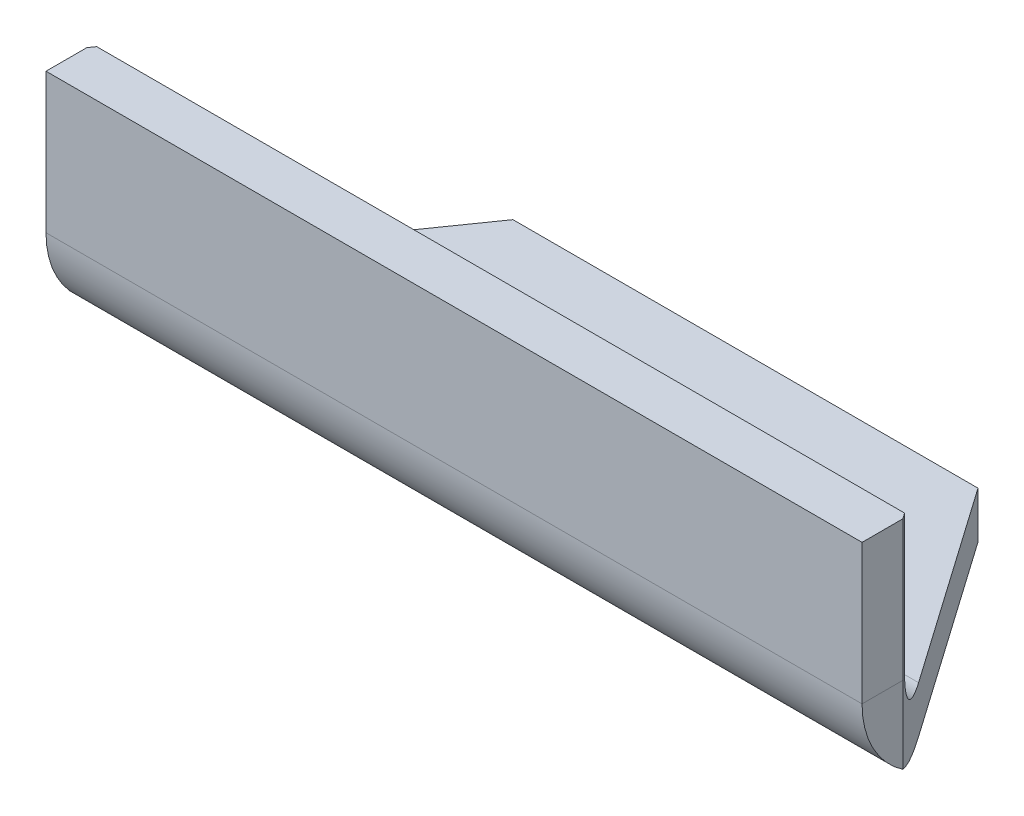
ISO-10303-21;
HEADER;
FILE_DESCRIPTION(('STEP AP214'),'2;1');
FILE_NAME('part.step','',(''),(''),'','','');
FILE_SCHEMA(('AUTOMOTIVE_DESIGN { 1 0 10303 214 1 1 1 1 }'));
ENDSEC;
DATA;
#1=APPLICATION_CONTEXT('core data for automotive mechanical design processes');
#2=APPLICATION_PROTOCOL_DEFINITION('international standard','automotive_design',2000,#1);
#3=PRODUCT_CONTEXT('',#1,'mechanical');
#4=PRODUCT('Part','Part','',(#3));
#5=PRODUCT_RELATED_PRODUCT_CATEGORY('part','',(#4));
#6=PRODUCT_DEFINITION_FORMATION('','',#4);
#7=PRODUCT_DEFINITION_CONTEXT('part definition',#1,'design');
#8=PRODUCT_DEFINITION('design','',#6,#7);
#9=PRODUCT_DEFINITION_SHAPE('','',#8);
#10=(LENGTH_UNIT() NAMED_UNIT(*) SI_UNIT(.MILLI.,.METRE.));
#11=(NAMED_UNIT(*) PLANE_ANGLE_UNIT() SI_UNIT($,.RADIAN.));
#12=(NAMED_UNIT(*) SI_UNIT($,.STERADIAN.) SOLID_ANGLE_UNIT());
#13=UNCERTAINTY_MEASURE_WITH_UNIT(LENGTH_MEASURE(1.E-05),#10,'distance_accuracy_value','');
#14=(GEOMETRIC_REPRESENTATION_CONTEXT(3) GLOBAL_UNCERTAINTY_ASSIGNED_CONTEXT((#13)) GLOBAL_UNIT_ASSIGNED_CONTEXT((#10,
#11,#12)) REPRESENTATION_CONTEXT('',''));
#15=CARTESIAN_POINT('',(0.,0.,0.));
#16=DIRECTION('',(0.,0.,1.));
#17=DIRECTION('',(1.,0.,0.));
#18=AXIS2_PLACEMENT_3D('',#15,#16,#17);
#19=CARTESIAN_POINT('',(0.,-8.,0.));
#20=DIRECTION('',(0.,-1.,0.));
#21=DIRECTION('',(0.,0.,-1.));
#22=AXIS2_PLACEMENT_3D('',#19,#20,#21);
#23=PLANE('',#22);
#24=DIRECTION('',(-1.,0.,0.));
#25=VECTOR('',#24,1.);
#26=CARTESIAN_POINT('',(-70.,-8.,-25.));
#27=LINE('',#26,#25);
#28=CARTESIAN_POINT('',(39.8910758569819,-8.,-25.));
#29=VERTEX_POINT('',#28);
#30=CARTESIAN_POINT('',(-39.8910758569819,-8.,-25.));
#31=VERTEX_POINT('',#30);
#32=EDGE_CURVE('E168',#29,#31,#27,.T.);
#33=ORIENTED_EDGE('',*,*,#32,.F.);
#34=DIRECTION('',(0.573576436351051,0.,0.819152044288988));
#35=VECTOR('',#34,1.);
#36=CARTESIAN_POINT('',(38.5134714293247,-8.,-26.9674230174378));
#37=LINE('',#36,#35);
#38=CARTESIAN_POINT('',(63.6981321561124,-8.00000000000003,9.00000000000002));
#39=VERTEX_POINT('',#38);
#40=EDGE_CURVE('E196',#39,#29,#37,.F.);
#41=ORIENTED_EDGE('',*,*,#40,.F.);
#42=DIRECTION('',(1.,0.,0.));
#43=VECTOR('',#42,1.);
#44=CARTESIAN_POINT('',(70.,-8.00000000000003,9.00000000000002));
#45=LINE('',#44,#43);
#46=CARTESIAN_POINT('',(-63.6981321561124,-8.00000000000003,9.00000000000002));
#47=VERTEX_POINT('',#46);
#48=EDGE_CURVE('E81',#39,#47,#45,.F.);
#49=ORIENTED_EDGE('',*,*,#48,.T.);
#50=DIRECTION('',(-0.573576436351051,0.,0.819152044288988));
#51=VECTOR('',#50,1.);
#52=CARTESIAN_POINT('',(-38.5134714293247,-8.,-26.9674230174378));
#53=LINE('',#52,#51);
#54=EDGE_CURVE('E13',#47,#31,#53,.F.);
#55=ORIENTED_EDGE('',*,*,#54,.T.);
#56=EDGE_LOOP('',(#33,#41,#49,#55));
#57=FACE_BOUND('',#56,.T.);
#58=ADVANCED_FACE('F58',(#57),#23,.T.);
#59=CARTESIAN_POINT('',(0.,0.,0.));
#60=DIRECTION('',(0.,-1.,0.));
#61=DIRECTION('',(0.,0.,-1.));
#62=AXIS2_PLACEMENT_3D('',#59,#60,#61);
#63=PLANE('',#62);
#64=DIRECTION('',(-0.573576436351051,0.,-0.819152044288988));
#65=VECTOR('',#64,1.);
#66=CARTESIAN_POINT('',(39.8910758569819,0.,-25.));
#67=LINE('',#66,#65);
#68=CARTESIAN_POINT('',(39.8910758569819,0.,-25.));
#69=VERTEX_POINT('',#68);
#70=CARTESIAN_POINT('',(63.6981321561124,0.,9.00000000000001));
#71=VERTEX_POINT('',#70);
#72=EDGE_CURVE('E203',#69,#71,#67,.F.);
#73=ORIENTED_EDGE('',*,*,#72,.F.);
#74=DIRECTION('',(-1.,0.,0.));
#75=VECTOR('',#74,1.);
#76=CARTESIAN_POINT('',(-70.,0.,-25.));
#77=LINE('',#76,#75);
#78=CARTESIAN_POINT('',(-39.8910758569819,0.,-25.));
#79=VERTEX_POINT('',#78);
#80=EDGE_CURVE('E171',#69,#79,#77,.T.);
#81=ORIENTED_EDGE('',*,*,#80,.T.);
#82=DIRECTION('',(0.573576436351051,0.,-0.819152044288988));
#83=VECTOR('',#82,1.);
#84=CARTESIAN_POINT('',(-39.8910758569819,0.,-25.));
#85=LINE('',#84,#83);
#86=CARTESIAN_POINT('',(-63.6981321561124,0.,9.00000000000001));
#87=VERTEX_POINT('',#86);
#88=EDGE_CURVE('E175',#79,#87,#85,.F.);
#89=ORIENTED_EDGE('',*,*,#88,.T.);
#90=DIRECTION('',(1.,0.,0.));
#91=VECTOR('',#90,1.);
#92=CARTESIAN_POINT('',(70.,0.,9.00000000000001));
#93=LINE('',#92,#91);
#94=EDGE_CURVE('E160',#71,#87,#93,.F.);
#95=ORIENTED_EDGE('',*,*,#94,.F.);
#96=EDGE_LOOP('',(#73,#81,#89,#95));
#97=FACE_BOUND('',#96,.T.);
#98=ADVANCED_FACE('F261',(#97),#63,.F.);
#99=CARTESIAN_POINT('',(-70.,-8.,-25.));
#100=DIRECTION('',(0.,0.,-1.));
#101=DIRECTION('',(-1.,0.,0.));
#102=AXIS2_PLACEMENT_3D('',#99,#100,#101);
#103=PLANE('',#102);
#104=ORIENTED_EDGE('',*,*,#80,.F.);
#105=DIRECTION('',(0.,1.,0.));
#106=VECTOR('',#105,1.);
#107=CARTESIAN_POINT('',(39.8910758569819,-8.,-25.));
#108=LINE('',#107,#106);
#109=EDGE_CURVE('E201',#29,#69,#108,.T.);
#110=ORIENTED_EDGE('',*,*,#109,.F.);
#111=ORIENTED_EDGE('',*,*,#32,.T.);
#112=DIRECTION('',(0.,1.,0.));
#113=VECTOR('',#112,1.);
#114=CARTESIAN_POINT('',(-39.8910758569819,-8.,-25.));
#115=LINE('',#114,#113);
#116=EDGE_CURVE('E170',#31,#79,#115,.T.);
#117=ORIENTED_EDGE('',*,*,#116,.T.);
#118=EDGE_LOOP('',(#104,#110,#111,#117));
#119=FACE_BOUND('',#118,.T.);
#120=ADVANCED_FACE('F200',(#119),#103,.T.);
#121=CARTESIAN_POINT('',(70.,7.99999999999997,9.00000000000001));
#122=DIRECTION('',(-1.,0.,0.));
#123=DIRECTION('',(0.,0.,1.));
#124=AXIS2_PLACEMENT_3D('',#121,#122,#123);
#125=PLANE('',#124);
#126=CARTESIAN_POINT('',(70.,7.99999999999997,9.00000000000001));
#127=DIRECTION('',(1.,0.,0.));
#128=DIRECTION('',(0.,0.,-1.));
#129=AXIS2_PLACEMENT_3D('',#126,#127,#128);
#130=CIRCLE('',#129,16.);
#131=CARTESIAN_POINT('',(70.,7.99999999999997,25.));
#132=VERTEX_POINT('',#131);
#133=CARTESIAN_POINT('',(70.,-5.22875655532285,18.0000000000002));
#134=VERTEX_POINT('',#133);
#135=EDGE_CURVE('E155',#132,#134,#130,.T.);
#136=ORIENTED_EDGE('',*,*,#135,.T.);
#137=DIRECTION('',(0.,-1.,0.));
#138=VECTOR('',#137,1.);
#139=CARTESIAN_POINT('',(70.,7.99999999999997,18.0000000000002));
#140=LINE('',#139,#138);
#141=CARTESIAN_POINT('',(70.,7.99999999999997,18.0000000000002));
#142=VERTEX_POINT('',#141);
#143=EDGE_CURVE('E141',#142,#134,#140,.T.);
#144=ORIENTED_EDGE('',*,*,#143,.F.);
#145=DIRECTION('',(0.,0.,-1.));
#146=VECTOR('',#145,1.);
#147=CARTESIAN_POINT('',(70.,7.99999999999997,17.));
#148=LINE('',#147,#146);
#149=EDGE_CURVE('E159',#142,#132,#148,.F.);
#150=ORIENTED_EDGE('',*,*,#149,.T.);
#151=EDGE_LOOP('',(#136,#144,#150));
#152=FACE_BOUND('',#151,.T.);
#153=ADVANCED_FACE('F158',(#152),#125,.F.);
#154=CARTESIAN_POINT('',(70.,7.99999999999997,9.00000000000001));
#155=DIRECTION('',(1.,0.,0.));
#156=DIRECTION('',(0.,0.,1.));
#157=AXIS2_PLACEMENT_3D('',#154,#155,#156);
#158=CYLINDRICAL_SURFACE('',#157,16.);
#159=ORIENTED_EDGE('',*,*,#48,.F.);
#160=CARTESIAN_POINT('',(63.6981321561124,7.99999999999997,9.00000000000001));
#161=DIRECTION('',(0.819152044288988,0.,-0.573576436351051));
#162=DIRECTION('',(-0.573576436351051,0.,-0.819152044288988));
#163=AXIS2_PLACEMENT_3D('',#160,#161,#162);
#164=ELLIPSE('',#163,19.5323934201834,16.);
#165=EDGE_CURVE('E144',#134,#39,#164,.T.);
#166=ORIENTED_EDGE('',*,*,#165,.F.);
#167=ORIENTED_EDGE('',*,*,#135,.F.);
#168=DIRECTION('',(1.,0.,0.));
#169=VECTOR('',#168,1.);
#170=CARTESIAN_POINT('',(-70.,7.99999999999997,25.));
#171=LINE('',#170,#169);
#172=CARTESIAN_POINT('',(-70.,7.99999999999997,25.));
#173=VERTEX_POINT('',#172);
#174=EDGE_CURVE('E225',#132,#173,#171,.F.);
#175=ORIENTED_EDGE('',*,*,#174,.T.);
#176=CARTESIAN_POINT('',(-70.,7.99999999999997,9.00000000000001));
#177=DIRECTION('',(1.,0.,0.));
#178=DIRECTION('',(0.,0.,-1.));
#179=AXIS2_PLACEMENT_3D('',#176,#177,#178);
#180=CIRCLE('',#179,16.);
#181=CARTESIAN_POINT('',(-70.,-5.22875655532285,18.0000000000002));
#182=VERTEX_POINT('',#181);
#183=EDGE_CURVE('E162',#182,#173,#180,.F.);
#184=ORIENTED_EDGE('',*,*,#183,.F.);
#185=CARTESIAN_POINT('',(-63.6981321561124,7.99999999999997,9.00000000000001));
#186=DIRECTION('',(0.819152044288988,0.,0.573576436351051));
#187=DIRECTION('',(0.573576436351051,0.,-0.819152044288988));
#188=AXIS2_PLACEMENT_3D('',#185,#186,#187);
#189=ELLIPSE('',#188,19.5323934201834,16.);
#190=EDGE_CURVE('E67',#182,#47,#189,.T.);
#191=ORIENTED_EDGE('',*,*,#190,.T.);
#192=EDGE_LOOP('',(#159,#166,#167,#175,#184,#191));
#193=FACE_BOUND('',#192,.T.);
#194=ADVANCED_FACE('F153',(#193),#158,.T.);
#195=CARTESIAN_POINT('',(70.,7.99999999999997,9.00000000000001));
#196=DIRECTION('',(1.,0.,0.));
#197=DIRECTION('',(0.,0.,1.));
#198=AXIS2_PLACEMENT_3D('',#195,#196,#197);
#199=CYLINDRICAL_SURFACE('',#198,8.);
#200=CARTESIAN_POINT('',(63.6981321561124,7.99999999999997,9.00000000000001));
#201=DIRECTION('',(0.819152044288988,0.,-0.573576436351051));
#202=DIRECTION('',(-0.573576436351051,0.,-0.819152044288988));
#203=AXIS2_PLACEMENT_3D('',#200,#201,#202);
#204=ELLIPSE('',#203,9.76619671009169,8.);
#205=CARTESIAN_POINT('',(69.2997924617902,7.99999999999997,17.));
#206=VERTEX_POINT('',#205);
#207=EDGE_CURVE('E207',#71,#206,#204,.F.);
#208=ORIENTED_EDGE('',*,*,#207,.F.);
#209=ORIENTED_EDGE('',*,*,#94,.T.);
#210=CARTESIAN_POINT('',(-63.6981321561124,7.99999999999997,9.00000000000001));
#211=DIRECTION('',(0.819152044288988,0.,0.573576436351051));
#212=DIRECTION('',(0.573576436351051,0.,-0.819152044288988));
#213=AXIS2_PLACEMENT_3D('',#210,#211,#212);
#214=ELLIPSE('',#213,9.76619671009169,8.);
#215=CARTESIAN_POINT('',(-69.2997924617902,7.99999999999997,17.));
#216=VERTEX_POINT('',#215);
#217=EDGE_CURVE('E178',#87,#216,#214,.F.);
#218=ORIENTED_EDGE('',*,*,#217,.T.);
#219=DIRECTION('',(1.,0.,0.));
#220=VECTOR('',#219,1.);
#221=CARTESIAN_POINT('',(-70.,7.99999999999997,17.));
#222=LINE('',#221,#220);
#223=EDGE_CURVE('E228',#216,#206,#222,.T.);
#224=ORIENTED_EDGE('',*,*,#223,.T.);
#225=EDGE_LOOP('',(#208,#209,#218,#224));
#226=FACE_BOUND('',#225,.T.);
#227=ADVANCED_FACE('F275',(#226),#199,.F.);
#228=CARTESIAN_POINT('',(70.,32.,25.));
#229=DIRECTION('',(-1.,0.,0.));
#230=DIRECTION('',(0.,-1.,0.));
#231=AXIS2_PLACEMENT_3D('',#228,#229,#230);
#232=PLANE('',#231);
#233=CARTESIAN_POINT('',(70.,32.,18.0000000000002));
#234=VERTEX_POINT('',#233);
#235=EDGE_CURVE('E146',#234,#142,#140,.T.);
#236=ORIENTED_EDGE('',*,*,#235,.F.);
#237=DIRECTION('',(0.,0.,-1.));
#238=VECTOR('',#237,1.);
#239=CARTESIAN_POINT('',(70.,32.,25.));
#240=LINE('',#239,#238);
#241=CARTESIAN_POINT('',(70.,32.,25.));
#242=VERTEX_POINT('',#241);
#243=EDGE_CURVE('E164',#242,#234,#240,.T.);
#244=ORIENTED_EDGE('',*,*,#243,.F.);
#245=DIRECTION('',(0.,1.,0.));
#246=VECTOR('',#245,1.);
#247=CARTESIAN_POINT('',(70.,0.,25.));
#248=LINE('',#247,#246);
#249=EDGE_CURVE('E218',#132,#242,#248,.T.);
#250=ORIENTED_EDGE('',*,*,#249,.F.);
#251=ORIENTED_EDGE('',*,*,#149,.F.);
#252=EDGE_LOOP('',(#236,#244,#250,#251));
#253=FACE_BOUND('',#252,.T.);
#254=ADVANCED_FACE('F280',(#253),#232,.F.);
#255=CARTESIAN_POINT('',(0.,0.,17.));
#256=DIRECTION('',(0.,0.,-1.));
#257=DIRECTION('',(-1.,0.,0.));
#258=AXIS2_PLACEMENT_3D('',#255,#256,#257);
#259=PLANE('',#258);
#260=DIRECTION('',(1.,0.,0.));
#261=VECTOR('',#260,1.);
#262=CARTESIAN_POINT('',(-70.,32.,17.));
#263=LINE('',#262,#261);
#264=CARTESIAN_POINT('',(69.2997924617901,32.,17.));
#265=VERTEX_POINT('',#264);
#266=CARTESIAN_POINT('',(-69.2997924617901,32.,17.));
#267=VERTEX_POINT('',#266);
#268=EDGE_CURVE('E223',#265,#267,#263,.F.);
#269=ORIENTED_EDGE('',*,*,#268,.F.);
#270=DIRECTION('',(0.,-1.,0.));
#271=VECTOR('',#270,1.);
#272=CARTESIAN_POINT('',(69.2997924617901,0.,17.));
#273=LINE('',#272,#271);
#274=EDGE_CURVE('E74',#206,#265,#273,.F.);
#275=ORIENTED_EDGE('',*,*,#274,.F.);
#276=ORIENTED_EDGE('',*,*,#223,.F.);
#277=DIRECTION('',(0.,-1.,0.));
#278=VECTOR('',#277,1.);
#279=CARTESIAN_POINT('',(-69.2997924617901,0.,17.));
#280=LINE('',#279,#278);
#281=EDGE_CURVE('E180',#216,#267,#280,.F.);
#282=ORIENTED_EDGE('',*,*,#281,.T.);
#283=EDGE_LOOP('',(#269,#275,#276,#282));
#284=FACE_BOUND('',#283,.T.);
#285=ADVANCED_FACE('F256',(#284),#259,.T.);
#286=CARTESIAN_POINT('',(-70.,32.,25.));
#287=DIRECTION('',(0.,-1.,0.));
#288=DIRECTION('',(0.,0.,-1.));
#289=AXIS2_PLACEMENT_3D('',#286,#287,#288);
#290=PLANE('',#289);
#291=DIRECTION('',(-0.573576436351051,0.,-0.819152044288988));
#292=VECTOR('',#291,1.);
#293=CARTESIAN_POINT('',(39.8910758569819,32.,-25.));
#294=LINE('',#293,#292);
#295=EDGE_CURVE('E393',#265,#234,#294,.F.);
#296=ORIENTED_EDGE('',*,*,#295,.F.);
#297=ORIENTED_EDGE('',*,*,#268,.T.);
#298=DIRECTION('',(0.573576436351051,0.,-0.819152044288988));
#299=VECTOR('',#298,1.);
#300=CARTESIAN_POINT('',(-39.8910758569819,32.,-25.));
#301=LINE('',#300,#299);
#302=CARTESIAN_POINT('',(-70.,32.,18.0000000000002));
#303=VERTEX_POINT('',#302);
#304=EDGE_CURVE('E183',#267,#303,#301,.F.);
#305=ORIENTED_EDGE('',*,*,#304,.T.);
#306=DIRECTION('',(0.,0.,-1.));
#307=VECTOR('',#306,1.);
#308=CARTESIAN_POINT('',(-70.,32.,25.));
#309=LINE('',#308,#307);
#310=CARTESIAN_POINT('',(-70.,32.,25.));
#311=VERTEX_POINT('',#310);
#312=EDGE_CURVE('E213',#311,#303,#309,.T.);
#313=ORIENTED_EDGE('',*,*,#312,.F.);
#314=DIRECTION('',(-1.,0.,0.));
#315=VECTOR('',#314,1.);
#316=CARTESIAN_POINT('',(0.,32.,25.));
#317=LINE('',#316,#315);
#318=EDGE_CURVE('E216',#242,#311,#317,.T.);
#319=ORIENTED_EDGE('',*,*,#318,.F.);
#320=ORIENTED_EDGE('',*,*,#243,.T.);
#321=EDGE_LOOP('',(#296,#297,#305,#313,#319,#320));
#322=FACE_BOUND('',#321,.T.);
#323=ADVANCED_FACE('F245',(#322),#290,.F.);
#324=CARTESIAN_POINT('',(-70.,7.99999999999997,9.00000000000001));
#325=DIRECTION('',(-1.,0.,0.));
#326=DIRECTION('',(0.,0.,1.));
#327=AXIS2_PLACEMENT_3D('',#324,#325,#326);
#328=PLANE('',#327);
#329=DIRECTION('',(0.,0.,-1.));
#330=VECTOR('',#329,1.);
#331=CARTESIAN_POINT('',(-70.,7.99999999999997,25.));
#332=LINE('',#331,#330);
#333=CARTESIAN_POINT('',(-70.,7.99999999999997,18.0000000000002));
#334=VERTEX_POINT('',#333);
#335=EDGE_CURVE('E205',#334,#173,#332,.F.);
#336=ORIENTED_EDGE('',*,*,#335,.F.);
#337=DIRECTION('',(0.,-1.,0.));
#338=VECTOR('',#337,1.);
#339=CARTESIAN_POINT('',(-70.,7.99999999999997,18.0000000000002));
#340=LINE('',#339,#338);
#341=EDGE_CURVE('E187',#334,#182,#340,.T.);
#342=ORIENTED_EDGE('',*,*,#341,.T.);
#343=ORIENTED_EDGE('',*,*,#183,.T.);
#344=EDGE_LOOP('',(#336,#342,#343));
#345=FACE_BOUND('',#344,.T.);
#346=ADVANCED_FACE('F248',(#345),#328,.T.);
#347=CARTESIAN_POINT('',(-70.,0.,25.));
#348=DIRECTION('',(1.,0.,0.));
#349=DIRECTION('',(0.,0.,-1.));
#350=AXIS2_PLACEMENT_3D('',#347,#348,#349);
#351=PLANE('',#350);
#352=ORIENTED_EDGE('',*,*,#312,.T.);
#353=DIRECTION('',(0.,1.,0.));
#354=VECTOR('',#353,1.);
#355=CARTESIAN_POINT('',(-70.,-8.,18.0000000000002));
#356=LINE('',#355,#354);
#357=EDGE_CURVE('E185',#303,#334,#356,.F.);
#358=ORIENTED_EDGE('',*,*,#357,.T.);
#359=ORIENTED_EDGE('',*,*,#335,.T.);
#360=DIRECTION('',(0.,-1.,0.));
#361=VECTOR('',#360,1.);
#362=CARTESIAN_POINT('',(-70.,0.,25.));
#363=LINE('',#362,#361);
#364=EDGE_CURVE('E220',#311,#173,#363,.T.);
#365=ORIENTED_EDGE('',*,*,#364,.F.);
#366=EDGE_LOOP('',(#352,#358,#359,#365));
#367=FACE_BOUND('',#366,.T.);
#368=ADVANCED_FACE('F235',(#367),#351,.F.);
#369=CARTESIAN_POINT('',(0.,0.,25.));
#370=DIRECTION('',(0.,0.,-1.));
#371=DIRECTION('',(-1.,0.,0.));
#372=AXIS2_PLACEMENT_3D('',#369,#370,#371);
#373=PLANE('',#372);
#374=ORIENTED_EDGE('',*,*,#174,.F.);
#375=ORIENTED_EDGE('',*,*,#249,.T.);
#376=ORIENTED_EDGE('',*,*,#318,.T.);
#377=ORIENTED_EDGE('',*,*,#364,.T.);
#378=EDGE_LOOP('',(#374,#375,#376,#377));
#379=FACE_BOUND('',#378,.T.);
#380=ADVANCED_FACE('F240',(#379),#373,.F.);
#381=CARTESIAN_POINT('',(-39.8910758569819,-8.,-25.));
#382=DIRECTION('',(0.819152044288988,0.,0.573576436351051));
#383=DIRECTION('',(0.,1.,0.));
#384=AXIS2_PLACEMENT_3D('',#381,#382,#383);
#385=PLANE('',#384);
#386=ORIENTED_EDGE('',*,*,#190,.F.);
#387=ORIENTED_EDGE('',*,*,#341,.F.);
#388=ORIENTED_EDGE('',*,*,#357,.F.);
#389=ORIENTED_EDGE('',*,*,#304,.F.);
#390=ORIENTED_EDGE('',*,*,#281,.F.);
#391=ORIENTED_EDGE('',*,*,#217,.F.);
#392=ORIENTED_EDGE('',*,*,#88,.F.);
#393=ORIENTED_EDGE('',*,*,#116,.F.);
#394=ORIENTED_EDGE('',*,*,#54,.F.);
#395=EDGE_LOOP('',(#386,#387,#388,#389,#390,#391,#392,#393,#394));
#396=FACE_BOUND('',#395,.T.);
#397=ADVANCED_FACE('F61',(#396),#385,.F.);
#398=CARTESIAN_POINT('',(39.8910758569819,-8.,-25.));
#399=DIRECTION('',(-0.819152044288988,0.,0.573576436351051));
#400=DIRECTION('',(0.,1.,0.));
#401=AXIS2_PLACEMENT_3D('',#398,#399,#400);
#402=PLANE('',#401);
#403=ORIENTED_EDGE('',*,*,#165,.T.);
#404=ORIENTED_EDGE('',*,*,#40,.T.);
#405=ORIENTED_EDGE('',*,*,#109,.T.);
#406=ORIENTED_EDGE('',*,*,#72,.T.);
#407=ORIENTED_EDGE('',*,*,#207,.T.);
#408=ORIENTED_EDGE('',*,*,#274,.T.);
#409=ORIENTED_EDGE('',*,*,#295,.T.);
#410=ORIENTED_EDGE('',*,*,#235,.T.);
#411=ORIENTED_EDGE('',*,*,#143,.T.);
#412=EDGE_LOOP('',(#403,#404,#405,#406,#407,#408,#409,#410,#411));
#413=FACE_BOUND('',#412,.T.);
#414=ADVANCED_FACE('F143',(#413),#402,.F.);
#415=CLOSED_SHELL('',(#58,#98,#120,#153,#194,#227,#254,#285,#323,#346,#368,#380,#397,#414));
#416=MANIFOLD_SOLID_BREP('B2',#415);
#417=ADVANCED_BREP_SHAPE_REPRESENTATION('',(#18,#416),#14);
#418=SHAPE_DEFINITION_REPRESENTATION(#9,#417);
ENDSEC;
END-ISO-10303-21;
